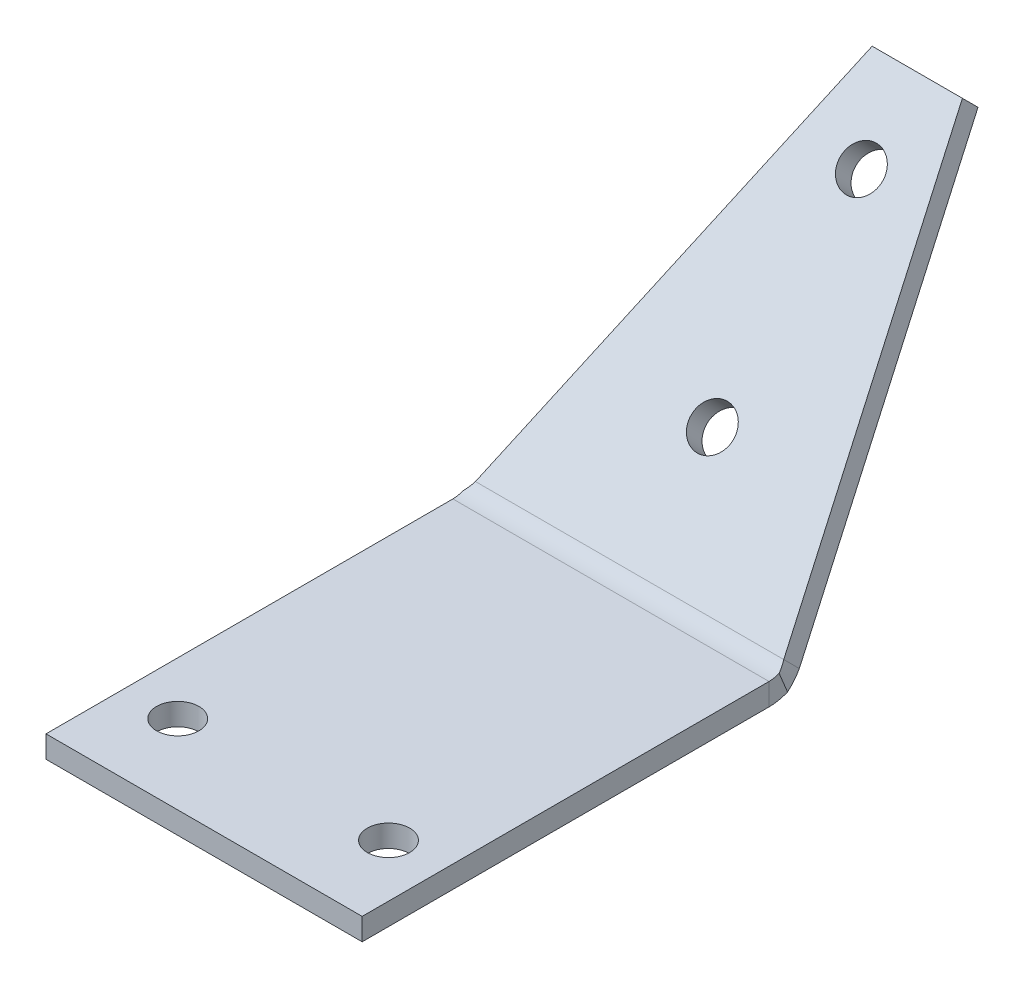
ISO-10303-21;
HEADER;
FILE_DESCRIPTION(('STEP AP214'),'2;1');
FILE_NAME('part.step','',(''),(''),'','','');
FILE_SCHEMA(('AUTOMOTIVE_DESIGN { 1 0 10303 214 1 1 1 1 }'));
ENDSEC;
DATA;
#1=APPLICATION_CONTEXT('core data for automotive mechanical design processes');
#2=APPLICATION_PROTOCOL_DEFINITION('international standard','automotive_design',2000,#1);
#3=PRODUCT_CONTEXT('',#1,'mechanical');
#4=PRODUCT('Part','Part','',(#3));
#5=PRODUCT_RELATED_PRODUCT_CATEGORY('part','',(#4));
#6=PRODUCT_DEFINITION_FORMATION('','',#4);
#7=PRODUCT_DEFINITION_CONTEXT('part definition',#1,'design');
#8=PRODUCT_DEFINITION('design','',#6,#7);
#9=PRODUCT_DEFINITION_SHAPE('','',#8);
#10=(LENGTH_UNIT() NAMED_UNIT(*) SI_UNIT(.MILLI.,.METRE.));
#11=(NAMED_UNIT(*) PLANE_ANGLE_UNIT() SI_UNIT($,.RADIAN.));
#12=(NAMED_UNIT(*) SI_UNIT($,.STERADIAN.) SOLID_ANGLE_UNIT());
#13=UNCERTAINTY_MEASURE_WITH_UNIT(LENGTH_MEASURE(1.E-05),#10,'distance_accuracy_value','');
#14=(GEOMETRIC_REPRESENTATION_CONTEXT(3) GLOBAL_UNCERTAINTY_ASSIGNED_CONTEXT((#13)) GLOBAL_UNIT_ASSIGNED_CONTEXT((#10,
#11,#12)) REPRESENTATION_CONTEXT('',''));
#15=CARTESIAN_POINT('',(0.,0.,0.));
#16=DIRECTION('',(0.,0.,1.));
#17=DIRECTION('',(1.,0.,0.));
#18=AXIS2_PLACEMENT_3D('',#15,#16,#17);
#19=CARTESIAN_POINT('',(0.,-20.1597563455184,-8.54422197756793));
#20=DIRECTION('',(0.,0.707106781186546,0.707106781186549));
#21=DIRECTION('',(0.,-0.707106781186549,0.707106781186546));
#22=AXIS2_PLACEMENT_3D('',#19,#20,#21);
#23=PLANE('',#22);
#24=CARTESIAN_POINT('',(0.,9.02607604795644,-37.7300543710427));
#25=DIRECTION('',(0.,0.707106781186546,0.707106781186549));
#26=DIRECTION('',(0.,-0.707106781186549,0.707106781186546));
#27=AXIS2_PLACEMENT_3D('',#24,#25,#26);
#28=CIRCLE('',#27,2.55269999999999);
#29=CARTESIAN_POINT('',(0.,7.22104456762154,-35.9250228907078));
#30=VERTEX_POINT('',#29);
#31=EDGE_CURVE('E145',#30,#30,#28,.T.);
#32=ORIENTED_EDGE('',*,*,#31,.T.);
#33=EDGE_LOOP('',(#32));
#34=FACE_BOUND('',#33,.T.);
#35=CARTESIAN_POINT('',(0.,26.9865882900948,-55.6905666131809));
#36=DIRECTION('',(0.,0.707106781186546,0.707106781186549));
#37=DIRECTION('',(0.,-0.707106781186549,0.707106781186546));
#38=AXIS2_PLACEMENT_3D('',#35,#36,#37);
#39=CIRCLE('',#38,2.55269999999999);
#40=CARTESIAN_POINT('',(0.,25.1815568097599,-53.885535132846));
#41=VERTEX_POINT('',#40);
#42=EDGE_CURVE('E178',#41,#41,#39,.T.);
#43=ORIENTED_EDGE('',*,*,#42,.T.);
#44=EDGE_LOOP('',(#43));
#45=FACE_BOUND('',#44,.T.);
#46=DIRECTION('',(-0.258819045102515,0.683012701892222,-0.683012701892219));
#47=VECTOR('',#46,1.);
#48=CARTESIAN_POINT('',(5.43818102449931,33.7217803808967,-62.4257587039828));
#49=LINE('',#48,#47);
#50=CARTESIAN_POINT('',(18.5761348278225,-0.948733610794953,-27.7552447122913));
#51=VERTEX_POINT('',#50);
#52=CARTESIAN_POINT('',(5.43818102449931,33.7217803808967,-62.4257587039828));
#53=VERTEX_POINT('',#52);
#54=EDGE_CURVE('E131',#51,#53,#49,.T.);
#55=ORIENTED_EDGE('',*,*,#54,.F.);
#56=DIRECTION('',(-1.,0.,0.));
#57=VECTOR('',#56,1.);
#58=CARTESIAN_POINT('',(0.,-0.948733610794946,-27.7552447122913));
#59=LINE('',#58,#57);
#60=CARTESIAN_POINT('',(-18.5761348278226,-0.948733610794956,-27.7552447122913));
#61=VERTEX_POINT('',#60);
#62=EDGE_CURVE('E116',#51,#61,#59,.T.);
#63=ORIENTED_EDGE('',*,*,#62,.T.);
#64=DIRECTION('',(-0.258819045102514,-0.683012701892222,0.683012701892219));
#65=VECTOR('',#64,1.);
#66=CARTESIAN_POINT('',(-19.05,-2.19924410338002,-26.5047342197062));
#67=LINE('',#66,#65);
#68=CARTESIAN_POINT('',(-5.43818102449932,33.7217803808967,-62.4257587039828));
#69=VERTEX_POINT('',#68);
#70=EDGE_CURVE('E197',#69,#61,#67,.T.);
#71=ORIENTED_EDGE('',*,*,#70,.F.);
#72=DIRECTION('',(-1.,0.,0.));
#73=VECTOR('',#72,1.);
#74=CARTESIAN_POINT('',(-5.43818102449932,33.7217803808967,-62.4257587039828));
#75=LINE('',#74,#73);
#76=EDGE_CURVE('E114',#53,#69,#75,.T.);
#77=ORIENTED_EDGE('',*,*,#76,.F.);
#78=EDGE_LOOP('',(#55,#63,#71,#77));
#79=FACE_BOUND('',#78,.T.);
#80=ADVANCED_FACE('F70',(#34,#45,#79),#23,.F.);
#81=CARTESIAN_POINT('',(0.,-18.2810867649907,-6.66555239704025));
#82=DIRECTION('',(0.,0.707106781186546,0.707106781186549));
#83=DIRECTION('',(0.,-0.707106781186549,0.707106781186546));
#84=AXIS2_PLACEMENT_3D('',#81,#82,#83);
#85=PLANE('',#84);
#86=DIRECTION('',(-1.,0.,0.));
#87=VECTOR('',#86,1.);
#88=CARTESIAN_POINT('',(0.,0.929935969732718,-25.8765751317636));
#89=LINE('',#88,#87);
#90=CARTESIAN_POINT('',(18.5761348278225,0.929935969732714,-25.8765751317636));
#91=VERTEX_POINT('',#90);
#92=CARTESIAN_POINT('',(-18.5761348278226,0.929935969732707,-25.8765751317636));
#93=VERTEX_POINT('',#92);
#94=EDGE_CURVE('E81',#91,#93,#89,.T.);
#95=ORIENTED_EDGE('',*,*,#94,.F.);
#96=DIRECTION('',(-0.258819045102515,0.683012701892222,-0.683012701892219));
#97=VECTOR('',#96,1.);
#98=CARTESIAN_POINT('',(5.43818102449931,35.6004499614243,-60.5470891234551));
#99=LINE('',#98,#97);
#100=CARTESIAN_POINT('',(5.43818102449931,35.6004499614243,-60.5470891234551));
#101=VERTEX_POINT('',#100);
#102=EDGE_CURVE('E128',#91,#101,#99,.T.);
#103=ORIENTED_EDGE('',*,*,#102,.T.);
#104=DIRECTION('',(-1.,0.,0.));
#105=VECTOR('',#104,1.);
#106=CARTESIAN_POINT('',(-5.43818102449932,35.6004499614243,-60.5470891234551));
#107=LINE('',#106,#105);
#108=CARTESIAN_POINT('',(-5.43818102449932,35.6004499614243,-60.5470891234551));
#109=VERTEX_POINT('',#108);
#110=EDGE_CURVE('E112',#101,#109,#107,.T.);
#111=ORIENTED_EDGE('',*,*,#110,.T.);
#112=DIRECTION('',(-0.258819045102514,-0.683012701892222,0.683012701892219));
#113=VECTOR('',#112,1.);
#114=CARTESIAN_POINT('',(-19.05,-0.32057452285237,-24.6260646391785));
#115=LINE('',#114,#113);
#116=EDGE_CURVE('E125',#109,#93,#115,.T.);
#117=ORIENTED_EDGE('',*,*,#116,.T.);
#118=EDGE_LOOP('',(#95,#103,#111,#117));
#119=FACE_BOUND('',#118,.T.);
#120=CARTESIAN_POINT('',(0.,28.8652578706224,-53.8118970326533));
#121=DIRECTION('',(0.,0.707106781186546,0.707106781186549));
#122=DIRECTION('',(0.,-0.707106781186549,0.707106781186546));
#123=AXIS2_PLACEMENT_3D('',#120,#121,#122);
#124=CIRCLE('',#123,2.55269999999999);
#125=CARTESIAN_POINT('',(0.,27.0602263902875,-52.0068655523184));
#126=VERTEX_POINT('',#125);
#127=EDGE_CURVE('E208',#126,#126,#124,.T.);
#128=ORIENTED_EDGE('',*,*,#127,.F.);
#129=EDGE_LOOP('',(#128));
#130=FACE_BOUND('',#129,.T.);
#131=CARTESIAN_POINT('',(0.,10.9047456284841,-35.851384790515));
#132=DIRECTION('',(0.,0.707106781186546,0.707106781186549));
#133=DIRECTION('',(0.,-0.707106781186549,0.707106781186546));
#134=AXIS2_PLACEMENT_3D('',#131,#132,#133);
#135=CIRCLE('',#134,2.55269999999999);
#136=CARTESIAN_POINT('',(0.,9.09971414814921,-34.0463533101801));
#137=VERTEX_POINT('',#136);
#138=EDGE_CURVE('E204',#137,#137,#135,.T.);
#139=ORIENTED_EDGE('',*,*,#138,.F.);
#140=EDGE_LOOP('',(#139));
#141=FACE_BOUND('',#140,.T.);
#142=ADVANCED_FACE('F122',(#119,#130,#141),#85,.T.);
#143=CARTESIAN_POINT('',(-19.05,-2.19924410338002,-26.5047342197062));
#144=DIRECTION('',(-0.96592582628907,0.183012701892215,-0.183012701892215));
#145=DIRECTION('',(-0.258819045102515,-0.683012701892222,0.683012701892219));
#146=AXIS2_PLACEMENT_3D('',#143,#144,#145);
#147=PLANE('',#146);
#148=CARTESIAN_POINT('',(-18.5761348278226,0.929935969732707,-25.8765751317636));
#149=CARTESIAN_POINT('',(-18.5761348278226,-0.948733610794953,-27.7552447122913));
#150=B_SPLINE_CURVE_WITH_KNOTS('',1,(#148,#149),.UNSPECIFIED.,.F.,.F.,(2,2),(0.,1.),.UNSPECIFIED.);
#151=EDGE_CURVE('E14',#93,#61,#150,.T.);
#152=ORIENTED_EDGE('',*,*,#151,.F.);
#153=ORIENTED_EDGE('',*,*,#116,.F.);
#154=DIRECTION('',(0.,0.707106781186546,0.707106781186549));
#155=VECTOR('',#154,1.);
#156=CARTESIAN_POINT('',(-5.43818102449932,33.7217803808967,-62.4257587039828));
#157=LINE('',#156,#155);
#158=EDGE_CURVE('E97',#69,#109,#157,.T.);
#159=ORIENTED_EDGE('',*,*,#158,.F.);
#160=ORIENTED_EDGE('',*,*,#70,.T.);
#161=EDGE_LOOP('',(#152,#153,#159,#160));
#162=FACE_BOUND('',#161,.T.);
#163=ADVANCED_FACE('F72',(#162),#147,.T.);
#164=CARTESIAN_POINT('',(-5.43818102449932,33.7217803808967,-62.4257587039828));
#165=DIRECTION('',(0.,0.707106781186549,-0.707106781186546));
#166=DIRECTION('',(-1.,0.,0.));
#167=AXIS2_PLACEMENT_3D('',#164,#165,#166);
#168=PLANE('',#167);
#169=ORIENTED_EDGE('',*,*,#110,.F.);
#170=DIRECTION('',(0.,0.707106781186546,0.707106781186549));
#171=VECTOR('',#170,1.);
#172=CARTESIAN_POINT('',(5.43818102449931,33.7217803808967,-62.4257587039828));
#173=LINE('',#172,#171);
#174=EDGE_CURVE('E117',#53,#101,#173,.T.);
#175=ORIENTED_EDGE('',*,*,#174,.F.);
#176=ORIENTED_EDGE('',*,*,#76,.T.);
#177=ORIENTED_EDGE('',*,*,#158,.T.);
#178=EDGE_LOOP('',(#169,#175,#176,#177));
#179=FACE_BOUND('',#178,.T.);
#180=ADVANCED_FACE('F110',(#179),#168,.T.);
#181=CARTESIAN_POINT('',(5.43818102449931,33.7217803808967,-62.4257587039828));
#182=DIRECTION('',(0.96592582628907,0.183012701892215,-0.183012701892215));
#183=DIRECTION('',(-0.258819045102515,0.683012701892222,-0.683012701892219));
#184=AXIS2_PLACEMENT_3D('',#181,#182,#183);
#185=PLANE('',#184);
#186=CARTESIAN_POINT('',(18.5761348278225,-0.948733610794953,-27.7552447122913));
#187=CARTESIAN_POINT('',(18.5761348278225,0.929935969732714,-25.8765751317636));
#188=B_SPLINE_CURVE_WITH_KNOTS('',1,(#186,#187),.UNSPECIFIED.,.F.,.F.,(2,2),(0.,1.),.UNSPECIFIED.);
#189=EDGE_CURVE('E141',#51,#91,#188,.T.);
#190=ORIENTED_EDGE('',*,*,#189,.F.);
#191=ORIENTED_EDGE('',*,*,#54,.T.);
#192=ORIENTED_EDGE('',*,*,#174,.T.);
#193=ORIENTED_EDGE('',*,*,#102,.F.);
#194=EDGE_LOOP('',(#190,#191,#192,#193));
#195=FACE_BOUND('',#194,.T.);
#196=ADVANCED_FACE('F152',(#195),#185,.T.);
#197=CARTESIAN_POINT('',(0.,10.9047456284841,-35.851384790515));
#198=DIRECTION('',(0.,0.707106781186546,0.707106781186549));
#199=DIRECTION('',(0.,-0.707106781186549,0.707106781186546));
#200=AXIS2_PLACEMENT_3D('',#197,#198,#199);
#201=CYLINDRICAL_SURFACE('',#200,2.55269999999999);
#202=ORIENTED_EDGE('',*,*,#31,.F.);
#203=EDGE_LOOP('',(#202));
#204=FACE_BOUND('',#203,.T.);
#205=ORIENTED_EDGE('',*,*,#138,.T.);
#206=EDGE_LOOP('',(#205));
#207=FACE_BOUND('',#206,.T.);
#208=ADVANCED_FACE('F161',(#204,#207),#201,.F.);
#209=CARTESIAN_POINT('',(0.,28.8652578706224,-53.8118970326533));
#210=DIRECTION('',(0.,0.707106781186546,0.707106781186549));
#211=DIRECTION('',(0.,-0.707106781186549,0.707106781186546));
#212=AXIS2_PLACEMENT_3D('',#209,#210,#211);
#213=CYLINDRICAL_SURFACE('',#212,2.55269999999999);
#214=ORIENTED_EDGE('',*,*,#42,.F.);
#215=EDGE_LOOP('',(#214));
#216=FACE_BOUND('',#215,.T.);
#217=ORIENTED_EDGE('',*,*,#127,.T.);
#218=EDGE_LOOP('',(#217));
#219=FACE_BOUND('',#218,.T.);
#220=ADVANCED_FACE('F508',(#216,#219),#213,.F.);
#221=CARTESIAN_POINT('',(12.7,0.,15.875));
#222=DIRECTION('',(0.,1.,0.));
#223=DIRECTION('',(0.,0.,1.));
#224=AXIS2_PLACEMENT_3D('',#221,#222,#223);
#225=CYLINDRICAL_SURFACE('',#224,2.55269999999999);
#226=CARTESIAN_POINT('',(12.7,-2.65684,15.875));
#227=DIRECTION('',(0.,1.,0.));
#228=DIRECTION('',(0.,0.,1.));
#229=AXIS2_PLACEMENT_3D('',#226,#227,#228);
#230=CIRCLE('',#229,2.55269999999999);
#231=CARTESIAN_POINT('',(12.7,-2.65684,18.4277));
#232=VERTEX_POINT('',#231);
#233=EDGE_CURVE('E231',#232,#232,#230,.T.);
#234=ORIENTED_EDGE('',*,*,#233,.F.);
#235=EDGE_LOOP('',(#234));
#236=FACE_BOUND('',#235,.T.);
#237=CARTESIAN_POINT('',(12.7,0.,15.875));
#238=DIRECTION('',(0.,1.,0.));
#239=DIRECTION('',(0.,0.,1.));
#240=AXIS2_PLACEMENT_3D('',#237,#238,#239);
#241=CIRCLE('',#240,2.55269999999999);
#242=CARTESIAN_POINT('',(12.7,0.,18.4277));
#243=VERTEX_POINT('',#242);
#244=EDGE_CURVE('E215',#243,#243,#241,.T.);
#245=ORIENTED_EDGE('',*,*,#244,.T.);
#246=EDGE_LOOP('',(#245));
#247=FACE_BOUND('',#246,.T.);
#248=ADVANCED_FACE('F281',(#236,#247),#225,.F.);
#249=CARTESIAN_POINT('',(-12.7,0.,15.875));
#250=DIRECTION('',(0.,1.,0.));
#251=DIRECTION('',(0.,0.,1.));
#252=AXIS2_PLACEMENT_3D('',#249,#250,#251);
#253=CYLINDRICAL_SURFACE('',#252,2.55269999999999);
#254=CARTESIAN_POINT('',(-12.7,-2.65684,15.875));
#255=DIRECTION('',(0.,1.,0.));
#256=DIRECTION('',(0.,0.,1.));
#257=AXIS2_PLACEMENT_3D('',#254,#255,#256);
#258=CIRCLE('',#257,2.55269999999999);
#259=CARTESIAN_POINT('',(-12.7,-2.65684,18.4277));
#260=VERTEX_POINT('',#259);
#261=EDGE_CURVE('E228',#260,#260,#258,.T.);
#262=ORIENTED_EDGE('',*,*,#261,.F.);
#263=EDGE_LOOP('',(#262));
#264=FACE_BOUND('',#263,.T.);
#265=CARTESIAN_POINT('',(-12.7,0.,15.875));
#266=DIRECTION('',(0.,1.,0.));
#267=DIRECTION('',(0.,0.,1.));
#268=AXIS2_PLACEMENT_3D('',#265,#266,#267);
#269=CIRCLE('',#268,2.55269999999999);
#270=CARTESIAN_POINT('',(-12.7,0.,18.4277));
#271=VERTEX_POINT('',#270);
#272=EDGE_CURVE('E219',#271,#271,#269,.T.);
#273=ORIENTED_EDGE('',*,*,#272,.T.);
#274=EDGE_LOOP('',(#273));
#275=FACE_BOUND('',#274,.T.);
#276=ADVANCED_FACE('F537',(#264,#275),#253,.F.);
#277=CARTESIAN_POINT('',(-19.05,-2.65684,25.4));
#278=DIRECTION('',(0.,0.,1.));
#279=DIRECTION('',(1.,0.,0.));
#280=AXIS2_PLACEMENT_3D('',#277,#278,#279);
#281=PLANE('',#280);
#282=DIRECTION('',(1.,0.,0.));
#283=VECTOR('',#282,1.);
#284=CARTESIAN_POINT('',(-19.05,0.,25.4));
#285=LINE('',#284,#283);
#286=CARTESIAN_POINT('',(-19.05,0.,25.4));
#287=VERTEX_POINT('',#286);
#288=CARTESIAN_POINT('',(19.05,0.,25.4));
#289=VERTEX_POINT('',#288);
#290=EDGE_CURVE('E249',#287,#289,#285,.T.);
#291=ORIENTED_EDGE('',*,*,#290,.F.);
#292=DIRECTION('',(0.,1.,0.));
#293=VECTOR('',#292,1.);
#294=CARTESIAN_POINT('',(-19.05,-2.65684,25.4));
#295=LINE('',#294,#293);
#296=CARTESIAN_POINT('',(-19.05,-2.65684,25.4));
#297=VERTEX_POINT('',#296);
#298=EDGE_CURVE('E211',#297,#287,#295,.T.);
#299=ORIENTED_EDGE('',*,*,#298,.F.);
#300=DIRECTION('',(1.,0.,0.));
#301=VECTOR('',#300,1.);
#302=CARTESIAN_POINT('',(-19.05,-2.65684,25.4));
#303=LINE('',#302,#301);
#304=CARTESIAN_POINT('',(19.05,-2.65684,25.4));
#305=VERTEX_POINT('',#304);
#306=EDGE_CURVE('E222',#297,#305,#303,.T.);
#307=ORIENTED_EDGE('',*,*,#306,.T.);
#308=DIRECTION('',(0.,1.,0.));
#309=VECTOR('',#308,1.);
#310=CARTESIAN_POINT('',(19.05,-2.65684,25.4));
#311=LINE('',#310,#309);
#312=EDGE_CURVE('E225',#305,#289,#311,.T.);
#313=ORIENTED_EDGE('',*,*,#312,.T.);
#314=EDGE_LOOP('',(#291,#299,#307,#313));
#315=FACE_BOUND('',#314,.T.);
#316=ADVANCED_FACE('F479',(#315),#281,.T.);
#317=CARTESIAN_POINT('',(0.,-2.65684,0.));
#318=DIRECTION('',(0.,1.,0.));
#319=DIRECTION('',(0.,0.,1.));
#320=AXIS2_PLACEMENT_3D('',#317,#318,#319);
#321=PLANE('',#320);
#322=DIRECTION('',(-1.,0.,0.));
#323=VECTOR('',#322,1.);
#324=CARTESIAN_POINT('',(0.,-2.65684,-23.6315111014964));
#325=LINE('',#324,#323);
#326=CARTESIAN_POINT('',(19.05,-2.65684,-23.6315111014964));
#327=VERTEX_POINT('',#326);
#328=CARTESIAN_POINT('',(-19.05,-2.65684,-23.6315111014964));
#329=VERTEX_POINT('',#328);
#330=EDGE_CURVE('E212',#327,#329,#325,.T.);
#331=ORIENTED_EDGE('',*,*,#330,.F.);
#332=DIRECTION('',(0.,0.,-1.));
#333=VECTOR('',#332,1.);
#334=CARTESIAN_POINT('',(19.05,-2.65684,-25.4));
#335=LINE('',#334,#333);
#336=EDGE_CURVE('E234',#305,#327,#335,.T.);
#337=ORIENTED_EDGE('',*,*,#336,.F.);
#338=ORIENTED_EDGE('',*,*,#306,.F.);
#339=DIRECTION('',(0.,0.,1.));
#340=VECTOR('',#339,1.);
#341=CARTESIAN_POINT('',(-19.05,-2.65684,-25.4));
#342=LINE('',#341,#340);
#343=EDGE_CURVE('E255',#329,#297,#342,.T.);
#344=ORIENTED_EDGE('',*,*,#343,.F.);
#345=EDGE_LOOP('',(#331,#337,#338,#344));
#346=FACE_BOUND('',#345,.T.);
#347=ORIENTED_EDGE('',*,*,#261,.T.);
#348=EDGE_LOOP('',(#347));
#349=FACE_BOUND('',#348,.T.);
#350=ORIENTED_EDGE('',*,*,#233,.T.);
#351=EDGE_LOOP('',(#350));
#352=FACE_BOUND('',#351,.T.);
#353=ADVANCED_FACE('F491',(#346,#349,#352),#321,.F.);
#354=CARTESIAN_POINT('',(19.05,-2.65684,-25.4));
#355=DIRECTION('',(1.,0.,0.));
#356=DIRECTION('',(0.,0.,-1.));
#357=AXIS2_PLACEMENT_3D('',#354,#355,#356);
#358=PLANE('',#357);
#359=ORIENTED_EDGE('',*,*,#336,.T.);
#360=DIRECTION('',(0.,1.,0.));
#361=VECTOR('',#360,1.);
#362=CARTESIAN_POINT('',(19.05,-2.65684,-23.6315111014964));
#363=LINE('',#362,#361);
#364=CARTESIAN_POINT('',(19.05,0.,-23.6315111014964));
#365=VERTEX_POINT('',#364);
#366=EDGE_CURVE('E237',#327,#365,#363,.T.);
#367=ORIENTED_EDGE('',*,*,#366,.T.);
#368=DIRECTION('',(0.,0.,-1.));
#369=VECTOR('',#368,1.);
#370=CARTESIAN_POINT('',(19.05,0.,-25.4));
#371=LINE('',#370,#369);
#372=EDGE_CURVE('E240',#289,#365,#371,.T.);
#373=ORIENTED_EDGE('',*,*,#372,.F.);
#374=ORIENTED_EDGE('',*,*,#312,.F.);
#375=EDGE_LOOP('',(#359,#367,#373,#374));
#376=FACE_BOUND('',#375,.T.);
#377=ADVANCED_FACE('F484',(#376),#358,.T.);
#378=CARTESIAN_POINT('',(0.,0.,0.));
#379=DIRECTION('',(0.,1.,0.));
#380=DIRECTION('',(0.,0.,1.));
#381=AXIS2_PLACEMENT_3D('',#378,#379,#380);
#382=PLANE('',#381);
#383=ORIENTED_EDGE('',*,*,#272,.F.);
#384=EDGE_LOOP('',(#383));
#385=FACE_BOUND('',#384,.T.);
#386=ORIENTED_EDGE('',*,*,#244,.F.);
#387=EDGE_LOOP('',(#386));
#388=FACE_BOUND('',#387,.T.);
#389=ORIENTED_EDGE('',*,*,#372,.T.);
#390=DIRECTION('',(-1.,0.,0.));
#391=VECTOR('',#390,1.);
#392=CARTESIAN_POINT('',(0.,0.,-23.6315111014964));
#393=LINE('',#392,#391);
#394=CARTESIAN_POINT('',(-19.05,0.,-23.6315111014964));
#395=VERTEX_POINT('',#394);
#396=EDGE_CURVE('E243',#365,#395,#393,.T.);
#397=ORIENTED_EDGE('',*,*,#396,.T.);
#398=DIRECTION('',(0.,0.,1.));
#399=VECTOR('',#398,1.);
#400=CARTESIAN_POINT('',(-19.05,0.,-25.4));
#401=LINE('',#400,#399);
#402=EDGE_CURVE('E246',#395,#287,#401,.T.);
#403=ORIENTED_EDGE('',*,*,#402,.T.);
#404=ORIENTED_EDGE('',*,*,#290,.T.);
#405=EDGE_LOOP('',(#389,#397,#403,#404));
#406=FACE_BOUND('',#405,.T.);
#407=ADVANCED_FACE('F486',(#385,#388,#406),#382,.T.);
#408=CARTESIAN_POINT('',(-19.05,-2.65684,-25.4));
#409=DIRECTION('',(-1.,0.,0.));
#410=DIRECTION('',(0.,0.,1.));
#411=AXIS2_PLACEMENT_3D('',#408,#409,#410);
#412=PLANE('',#411);
#413=ORIENTED_EDGE('',*,*,#402,.F.);
#414=DIRECTION('',(0.,-1.,0.));
#415=VECTOR('',#414,1.);
#416=CARTESIAN_POINT('',(-19.05,-2.65684,-23.6315111014964));
#417=LINE('',#416,#415);
#418=EDGE_CURVE('E252',#395,#329,#417,.T.);
#419=ORIENTED_EDGE('',*,*,#418,.T.);
#420=ORIENTED_EDGE('',*,*,#343,.T.);
#421=ORIENTED_EDGE('',*,*,#298,.T.);
#422=EDGE_LOOP('',(#413,#419,#420,#421));
#423=FACE_BOUND('',#422,.T.);
#424=ADVANCED_FACE('F488',(#423),#412,.T.);
#425=CARTESIAN_POINT('',(19.05,3.175,-23.6315111014964));
#426=DIRECTION('',(1.,0.,0.));
#427=DIRECTION('',(0.,0.,-1.));
#428=AXIS2_PLACEMENT_3D('',#425,#426,#427);
#429=PLANE('',#428);
#430=CARTESIAN_POINT('',(19.05,0.241682484276667,-24.8465309992555));
#431=CARTESIAN_POINT('',(19.05,-2.21291761288062,-25.8632596497003));
#432=B_SPLINE_CURVE_WITH_KNOTS('',1,(#430,#431),.UNSPECIFIED.,.F.,.F.,(2,2),(0.,1.),.UNSPECIFIED.);
#433=CARTESIAN_POINT('',(19.05,0.241682484276664,-24.8465309992555));
#434=VERTEX_POINT('',#433);
#435=CARTESIAN_POINT('',(19.05,-2.21291761288062,-25.8632596497003));
#436=VERTEX_POINT('',#435);
#437=EDGE_CURVE('E216',#434,#436,#432,.T.);
#438=ORIENTED_EDGE('',*,*,#437,.F.);
#439=CARTESIAN_POINT('',(19.05,3.175,-23.6315111014964));
#440=DIRECTION('',(1.,0.,0.));
#441=DIRECTION('',(0.,0.,-1.));
#442=AXIS2_PLACEMENT_3D('',#439,#440,#441);
#443=CIRCLE('',#442,3.175);
#444=EDGE_CURVE('E326',#434,#365,#443,.F.);
#445=ORIENTED_EDGE('',*,*,#444,.T.);
#446=ORIENTED_EDGE('',*,*,#366,.F.);
#447=CARTESIAN_POINT('',(19.05,3.175,-23.6315111014964));
#448=DIRECTION('',(-1.,0.,0.));
#449=DIRECTION('',(0.,0.,-1.));
#450=AXIS2_PLACEMENT_3D('',#447,#448,#449);
#451=CIRCLE('',#450,5.83184);
#452=EDGE_CURVE('E330',#436,#327,#451,.T.);
#453=ORIENTED_EDGE('',*,*,#452,.F.);
#454=EDGE_LOOP('',(#438,#445,#446,#453));
#455=FACE_BOUND('',#454,.T.);
#456=ADVANCED_FACE('F278',(#455),#429,.T.);
#457=CARTESIAN_POINT('',(-19.05,3.175,-23.6315111014964));
#458=DIRECTION('',(-1.,0.,0.));
#459=DIRECTION('',(0.,0.,1.));
#460=AXIS2_PLACEMENT_3D('',#457,#458,#459);
#461=PLANE('',#460);
#462=ORIENTED_EDGE('',*,*,#418,.F.);
#463=CARTESIAN_POINT('',(-19.05,3.175,-23.6315111014964));
#464=DIRECTION('',(1.,0.,0.));
#465=DIRECTION('',(0.,0.,-1.));
#466=AXIS2_PLACEMENT_3D('',#463,#464,#465);
#467=CIRCLE('',#466,3.175);
#468=CARTESIAN_POINT('',(-19.05,0.241682484276657,-24.8465309992555));
#469=VERTEX_POINT('',#468);
#470=EDGE_CURVE('E340',#395,#469,#467,.T.);
#471=ORIENTED_EDGE('',*,*,#470,.T.);
#472=CARTESIAN_POINT('',(-19.05,-2.21291761288062,-25.8632596497003));
#473=CARTESIAN_POINT('',(-19.05,0.241682484276657,-24.8465309992555));
#474=B_SPLINE_CURVE_WITH_KNOTS('',1,(#472,#473),.UNSPECIFIED.,.F.,.F.,(2,2),(0.,1.),.UNSPECIFIED.);
#475=CARTESIAN_POINT('',(-19.05,-2.21291761288062,-25.8632596497003));
#476=VERTEX_POINT('',#475);
#477=EDGE_CURVE('E334',#469,#476,#474,.F.);
#478=ORIENTED_EDGE('',*,*,#477,.T.);
#479=CARTESIAN_POINT('',(-19.05,3.175,-23.6315111014964));
#480=DIRECTION('',(1.,0.,0.));
#481=DIRECTION('',(0.,0.,1.));
#482=AXIS2_PLACEMENT_3D('',#479,#480,#481);
#483=CIRCLE('',#482,5.83184);
#484=EDGE_CURVE('E343',#329,#476,#483,.T.);
#485=ORIENTED_EDGE('',*,*,#484,.F.);
#486=EDGE_LOOP('',(#462,#471,#478,#485));
#487=FACE_BOUND('',#486,.T.);
#488=ADVANCED_FACE('F378',(#487),#461,.T.);
#489=CARTESIAN_POINT('',(-19.05,-2.21291761288062,-25.8632596497003));
#490=CARTESIAN_POINT('',(-18.8919550404998,-1.92061613863521,-26.5689378331253));
#491=CARTESIAN_POINT('',(-18.7341797873228,-1.48883630955139,-27.2151420135349));
#492=CARTESIAN_POINT('',(-18.5761348278226,-0.948733610794953,-27.7552447122913));
#493=CARTESIAN_POINT('',(-19.05,0.241682484276657,-24.8465309992555));
#494=CARTESIAN_POINT('',(-18.8919616899022,0.400812044538183,-25.2307037418133));
#495=CARTESIAN_POINT('',(-18.7341731379204,0.635902882246415,-25.5825420442773));
#496=CARTESIAN_POINT('',(-18.5761348278226,0.929935969732707,-25.8765751317636));
#497=B_SPLINE_SURFACE_WITH_KNOTS('',1,3,((#489,#490,#491,#492),(#493,#494,#495,#496)),
.UNSPECIFIED.,.F.,.F.,.F.,(2,2),(4,4),(0.,1.),(0.,1.),.UNSPECIFIED.);
#498=CARTESIAN_POINT('',(-19.05,0.241682484276657,-24.8465309992555));
#499=CARTESIAN_POINT('',(-18.8919616899022,0.400812044538183,-25.2307037418133));
#500=CARTESIAN_POINT('',(-18.7341731379204,0.635902882246415,-25.5825420442773));
#501=CARTESIAN_POINT('',(-18.5761348278226,0.929935969732707,-25.8765751317636));
#502=B_SPLINE_CURVE_WITH_KNOTS('',3,(#498,#499,#500,#501),.UNSPECIFIED.,.F.,.F.,(4,4),(0.,1.),.UNSPECIFIED.);
#503=EDGE_CURVE('E342',#469,#93,#502,.T.);
#504=CARTESIAN_POINT('',(-18.5761348278226,-0.948733610794953,-27.7552447122913));
#505=CARTESIAN_POINT('',(-18.7341797873228,-1.48883630955139,-27.2151420135349));
#506=CARTESIAN_POINT('',(-18.8919550404998,-1.92061613863521,-26.5689378331253));
#507=CARTESIAN_POINT('',(-19.05,-2.21291761288062,-25.8632596497003));
#508=B_SPLINE_CURVE_WITH_KNOTS('',3,(#504,#505,#506,#507),.UNSPECIFIED.,.F.,.F.,(4,4),(0.,1.),.UNSPECIFIED.);
#509=EDGE_CURVE('E88',#476,#61,#508,.F.);
#510=ORIENTED_EDGE('',*,*,#477,.F.);
#511=ORIENTED_EDGE('',*,*,#503,.T.);
#512=ORIENTED_EDGE('',*,*,#151,.T.);
#513=ORIENTED_EDGE('',*,*,#509,.F.);
#514=EDGE_LOOP('',(#510,#511,#512,#513));
#515=FACE_BOUND('',#514,.T.);
#516=ADVANCED_FACE('F277',(#515),#497,.T.);
#517=CARTESIAN_POINT('',(18.5761348278225,-0.948733610794953,-27.7552447122913));
#518=CARTESIAN_POINT('',(18.7341797873228,-1.48883630955138,-27.2151420135349));
#519=CARTESIAN_POINT('',(18.8919550404998,-1.92061613863521,-26.5689378331253));
#520=CARTESIAN_POINT('',(19.05,-2.21291761288062,-25.8632596497003));
#521=CARTESIAN_POINT('',(18.5761348278225,0.929935969732714,-25.8765751317636));
#522=CARTESIAN_POINT('',(18.7341731379204,0.635902882246412,-25.5825420442773));
#523=CARTESIAN_POINT('',(18.8919616899022,0.400812044538196,-25.2307037418134));
#524=CARTESIAN_POINT('',(19.05,0.241682484276667,-24.8465309992555));
#525=B_SPLINE_SURFACE_WITH_KNOTS('',1,3,((#517,#518,#519,#520),(#521,#522,#523,#524)),
.UNSPECIFIED.,.F.,.F.,.F.,(2,2),(4,4),(0.,1.),(0.,1.),.UNSPECIFIED.);
#526=CARTESIAN_POINT('',(18.5761348278225,0.929935969732714,-25.8765751317636));
#527=CARTESIAN_POINT('',(18.7341731379204,0.635902882246412,-25.5825420442773));
#528=CARTESIAN_POINT('',(18.8919616899022,0.400812044538196,-25.2307037418134));
#529=CARTESIAN_POINT('',(19.05,0.241682484276667,-24.8465309992555));
#530=B_SPLINE_CURVE_WITH_KNOTS('',3,(#526,#527,#528,#529),.UNSPECIFIED.,.F.,.F.,(4,4),(0.,1.),.UNSPECIFIED.);
#531=EDGE_CURVE('E337',#91,#434,#530,.T.);
#532=CARTESIAN_POINT('',(19.05,-2.21291761288062,-25.8632596497003));
#533=CARTESIAN_POINT('',(18.8919550404998,-1.92061613863521,-26.5689378331253));
#534=CARTESIAN_POINT('',(18.7341797873228,-1.48883630955138,-27.2151420135349));
#535=CARTESIAN_POINT('',(18.5761348278225,-0.948733610794953,-27.7552447122913));
#536=B_SPLINE_CURVE_WITH_KNOTS('',3,(#532,#533,#534,#535),.UNSPECIFIED.,.F.,.F.,(4,4),(0.,1.),.UNSPECIFIED.);
#537=EDGE_CURVE('E419',#51,#436,#536,.F.);
#538=ORIENTED_EDGE('',*,*,#531,.T.);
#539=ORIENTED_EDGE('',*,*,#437,.T.);
#540=ORIENTED_EDGE('',*,*,#537,.F.);
#541=ORIENTED_EDGE('',*,*,#189,.T.);
#542=EDGE_LOOP('',(#538,#539,#540,#541));
#543=FACE_BOUND('',#542,.T.);
#544=ADVANCED_FACE('F264',(#543),#525,.T.);
#545=CARTESIAN_POINT('',(-38.3559514381031,3.175,-23.6315111014964));
#546=DIRECTION('',(1.,0.,0.));
#547=DIRECTION('',(0.,0.,-1.));
#548=AXIS2_PLACEMENT_3D('',#545,#546,#547);
#549=CYLINDRICAL_SURFACE('',#548,5.83184);
#550=ORIENTED_EDGE('',*,*,#62,.F.);
#551=ORIENTED_EDGE('',*,*,#537,.T.);
#552=ORIENTED_EDGE('',*,*,#452,.T.);
#553=ORIENTED_EDGE('',*,*,#330,.T.);
#554=ORIENTED_EDGE('',*,*,#484,.T.);
#555=ORIENTED_EDGE('',*,*,#509,.T.);
#556=EDGE_LOOP('',(#550,#551,#552,#553,#554,#555));
#557=FACE_BOUND('',#556,.T.);
#558=ADVANCED_FACE('F276',(#557),#549,.T.);
#559=CARTESIAN_POINT('',(-38.3559514381031,3.175,-23.6315111014964));
#560=DIRECTION('',(1.,0.,0.));
#561=DIRECTION('',(0.,0.,-1.));
#562=AXIS2_PLACEMENT_3D('',#559,#560,#561);
#563=CYLINDRICAL_SURFACE('',#562,3.175);
#564=ORIENTED_EDGE('',*,*,#94,.T.);
#565=ORIENTED_EDGE('',*,*,#503,.F.);
#566=ORIENTED_EDGE('',*,*,#470,.F.);
#567=ORIENTED_EDGE('',*,*,#396,.F.);
#568=ORIENTED_EDGE('',*,*,#444,.F.);
#569=ORIENTED_EDGE('',*,*,#531,.F.);
#570=EDGE_LOOP('',(#564,#565,#566,#567,#568,#569));
#571=FACE_BOUND('',#570,.T.);
#572=ADVANCED_FACE('F336',(#571),#563,.F.);
#573=CLOSED_SHELL('',(#80,#142,#163,#180,#196,#208,#220,#248,#276,#316,#353,#377,#407,#424,#456,
#488,#516,#544,#558,#572));
#574=MANIFOLD_SOLID_BREP('B2',#573);
#575=ADVANCED_BREP_SHAPE_REPRESENTATION('',(#18,#574),#14);
#576=SHAPE_DEFINITION_REPRESENTATION(#9,#575);
ENDSEC;
END-ISO-10303-21;
